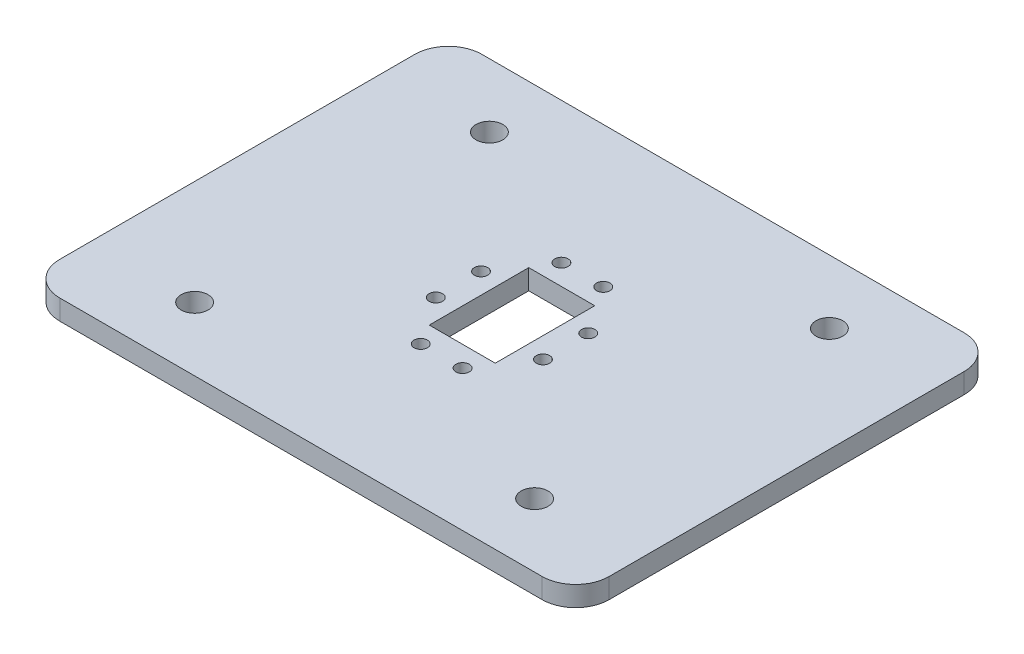
ISO-10303-21;
HEADER;
FILE_DESCRIPTION(('STEP AP214'),'2;1');
FILE_NAME('part.step','',(''),(''),'','','');
FILE_SCHEMA(('AUTOMOTIVE_DESIGN { 1 0 10303 214 1 1 1 1 }'));
ENDSEC;
DATA;
#1=APPLICATION_CONTEXT('core data for automotive mechanical design processes');
#2=APPLICATION_PROTOCOL_DEFINITION('international standard','automotive_design',2000,#1);
#3=PRODUCT_CONTEXT('',#1,'mechanical');
#4=PRODUCT('Part','Part','',(#3));
#5=PRODUCT_RELATED_PRODUCT_CATEGORY('part','',(#4));
#6=PRODUCT_DEFINITION_FORMATION('','',#4);
#7=PRODUCT_DEFINITION_CONTEXT('part definition',#1,'design');
#8=PRODUCT_DEFINITION('design','',#6,#7);
#9=PRODUCT_DEFINITION_SHAPE('','',#8);
#10=(LENGTH_UNIT() NAMED_UNIT(*) SI_UNIT(.MILLI.,.METRE.));
#11=(NAMED_UNIT(*) PLANE_ANGLE_UNIT() SI_UNIT($,.RADIAN.));
#12=(NAMED_UNIT(*) SI_UNIT($,.STERADIAN.) SOLID_ANGLE_UNIT());
#13=UNCERTAINTY_MEASURE_WITH_UNIT(LENGTH_MEASURE(1.E-05),#10,'distance_accuracy_value','');
#14=(GEOMETRIC_REPRESENTATION_CONTEXT(3) GLOBAL_UNCERTAINTY_ASSIGNED_CONTEXT((#13)) GLOBAL_UNIT_ASSIGNED_CONTEXT((#10,
#11,#12)) REPRESENTATION_CONTEXT('',''));
#15=CARTESIAN_POINT('',(0.,0.,0.));
#16=DIRECTION('',(0.,0.,1.));
#17=DIRECTION('',(1.,0.,0.));
#18=AXIS2_PLACEMENT_3D('',#15,#16,#17);
#19=CARTESIAN_POINT('',(0.,6.,0.));
#20=DIRECTION('',(0.,1.,0.));
#21=DIRECTION('',(0.,0.,1.));
#22=AXIS2_PLACEMENT_3D('',#19,#20,#21);
#23=PLANE('',#22);
#24=CARTESIAN_POINT('',(-88.25,6.,-84.));
#25=DIRECTION('',(0.,1.,0.));
#26=DIRECTION('',(0.,0.,1.));
#27=AXIS2_PLACEMENT_3D('',#24,#25,#26);
#28=CIRCLE('',#27,2.);
#29=CARTESIAN_POINT('',(-88.25,6.,-82.));
#30=VERTEX_POINT('',#29);
#31=EDGE_CURVE('E501',#30,#30,#28,.T.);
#32=ORIENTED_EDGE('',*,*,#31,.F.);
#33=EDGE_LOOP('',(#32));
#34=FACE_BOUND('',#33,.T.);
#35=CARTESIAN_POINT('',(-75.75,6.,-84.));
#36=DIRECTION('',(0.,1.,0.));
#37=DIRECTION('',(0.,0.,1.));
#38=AXIS2_PLACEMENT_3D('',#35,#36,#37);
#39=CIRCLE('',#38,2.);
#40=CARTESIAN_POINT('',(-75.75,6.,-82.));
#41=VERTEX_POINT('',#40);
#42=EDGE_CURVE('E511',#41,#41,#39,.T.);
#43=ORIENTED_EDGE('',*,*,#42,.F.);
#44=EDGE_LOOP('',(#43));
#45=FACE_BOUND('',#44,.T.);
#46=CARTESIAN_POINT('',(-98.,6.,-69.75));
#47=DIRECTION('',(0.,1.,0.));
#48=DIRECTION('',(0.,0.,1.));
#49=AXIS2_PLACEMENT_3D('',#46,#47,#48);
#50=CIRCLE('',#49,2.);
#51=CARTESIAN_POINT('',(-98.,6.,-67.75));
#52=VERTEX_POINT('',#51);
#53=EDGE_CURVE('E519',#52,#52,#50,.T.);
#54=ORIENTED_EDGE('',*,*,#53,.F.);
#55=EDGE_LOOP('',(#54));
#56=FACE_BOUND('',#55,.T.);
#57=CARTESIAN_POINT('',(-98.,6.,-56.25));
#58=DIRECTION('',(0.,1.,0.));
#59=DIRECTION('',(0.,0.,1.));
#60=AXIS2_PLACEMENT_3D('',#57,#58,#59);
#61=CIRCLE('',#60,2.);
#62=CARTESIAN_POINT('',(-98.,6.,-54.25));
#63=VERTEX_POINT('',#62);
#64=EDGE_CURVE('E158',#63,#63,#61,.T.);
#65=ORIENTED_EDGE('',*,*,#64,.F.);
#66=EDGE_LOOP('',(#65));
#67=FACE_BOUND('',#66,.T.);
#68=CARTESIAN_POINT('',(-88.25,6.,-42.));
#69=DIRECTION('',(0.,1.,0.));
#70=DIRECTION('',(0.,0.,1.));
#71=AXIS2_PLACEMENT_3D('',#68,#69,#70);
#72=CIRCLE('',#71,2.);
#73=CARTESIAN_POINT('',(-88.25,6.,-40.));
#74=VERTEX_POINT('',#73);
#75=EDGE_CURVE('E460',#74,#74,#72,.T.);
#76=ORIENTED_EDGE('',*,*,#75,.F.);
#77=EDGE_LOOP('',(#76));
#78=FACE_BOUND('',#77,.T.);
#79=CARTESIAN_POINT('',(-75.75,6.,-42.));
#80=DIRECTION('',(0.,1.,0.));
#81=DIRECTION('',(0.,0.,1.));
#82=AXIS2_PLACEMENT_3D('',#79,#80,#81);
#83=CIRCLE('',#82,2.);
#84=CARTESIAN_POINT('',(-75.75,6.,-40.));
#85=VERTEX_POINT('',#84);
#86=EDGE_CURVE('E469',#85,#85,#83,.T.);
#87=ORIENTED_EDGE('',*,*,#86,.F.);
#88=EDGE_LOOP('',(#87));
#89=FACE_BOUND('',#88,.T.);
#90=CARTESIAN_POINT('',(-66.,6.,-56.25));
#91=DIRECTION('',(0.,1.,0.));
#92=DIRECTION('',(0.,0.,1.));
#93=AXIS2_PLACEMENT_3D('',#90,#91,#92);
#94=CIRCLE('',#93,2.);
#95=CARTESIAN_POINT('',(-66.,6.,-54.25));
#96=VERTEX_POINT('',#95);
#97=EDGE_CURVE('E485',#96,#96,#94,.T.);
#98=ORIENTED_EDGE('',*,*,#97,.F.);
#99=EDGE_LOOP('',(#98));
#100=FACE_BOUND('',#99,.T.);
#101=CARTESIAN_POINT('',(-66.,6.,-69.75));
#102=DIRECTION('',(0.,1.,0.));
#103=DIRECTION('',(0.,0.,1.));
#104=AXIS2_PLACEMENT_3D('',#101,#102,#103);
#105=CIRCLE('',#104,2.);
#106=CARTESIAN_POINT('',(-66.,6.,-67.75));
#107=VERTEX_POINT('',#106);
#108=EDGE_CURVE('E493',#107,#107,#105,.T.);
#109=ORIENTED_EDGE('',*,*,#108,.F.);
#110=EDGE_LOOP('',(#109));
#111=FACE_BOUND('',#110,.T.);
#112=DIRECTION('',(0.,0.,1.));
#113=VECTOR('',#112,1.);
#114=CARTESIAN_POINT('',(-91.85,6.,-77.85));
#115=LINE('',#114,#113);
#116=CARTESIAN_POINT('',(-91.85,6.,-77.85));
#117=VERTEX_POINT('',#116);
#118=CARTESIAN_POINT('',(-91.85,6.,-48.15));
#119=VERTEX_POINT('',#118);
#120=EDGE_CURVE('E57',#117,#119,#115,.T.);
#121=ORIENTED_EDGE('',*,*,#120,.F.);
#122=DIRECTION('',(-1.,0.,0.));
#123=VECTOR('',#122,1.);
#124=CARTESIAN_POINT('',(-91.85,6.,-77.85));
#125=LINE('',#124,#123);
#126=CARTESIAN_POINT('',(-72.15,6.,-77.85));
#127=VERTEX_POINT('',#126);
#128=EDGE_CURVE('E151',#127,#117,#125,.T.);
#129=ORIENTED_EDGE('',*,*,#128,.F.);
#130=DIRECTION('',(0.,0.,-1.));
#131=VECTOR('',#130,1.);
#132=CARTESIAN_POINT('',(-72.15,6.,-77.85));
#133=LINE('',#132,#131);
#134=CARTESIAN_POINT('',(-72.15,6.,-48.15));
#135=VERTEX_POINT('',#134);
#136=EDGE_CURVE('E155',#135,#127,#133,.T.);
#137=ORIENTED_EDGE('',*,*,#136,.F.);
#138=DIRECTION('',(1.,0.,0.));
#139=VECTOR('',#138,1.);
#140=CARTESIAN_POINT('',(-91.85,6.,-48.15));
#141=LINE('',#140,#139);
#142=EDGE_CURVE('E169',#119,#135,#141,.T.);
#143=ORIENTED_EDGE('',*,*,#142,.F.);
#144=EDGE_LOOP('',(#121,#129,#137,#143));
#145=FACE_BOUND('',#144,.T.);
#146=CARTESIAN_POINT('',(-132.75,6.,-19.));
#147=DIRECTION('',(0.,1.,0.));
#148=DIRECTION('',(0.,0.,1.));
#149=AXIS2_PLACEMENT_3D('',#146,#147,#148);
#150=CIRCLE('',#149,3.99999999999999);
#151=CARTESIAN_POINT('',(-132.75,6.,-15.));
#152=VERTEX_POINT('',#151);
#153=EDGE_CURVE('E200',#152,#152,#150,.T.);
#154=ORIENTED_EDGE('',*,*,#153,.F.);
#155=EDGE_LOOP('',(#154));
#156=FACE_BOUND('',#155,.T.);
#157=CARTESIAN_POINT('',(-132.75,6.,-107.));
#158=DIRECTION('',(0.,1.,0.));
#159=DIRECTION('',(0.,0.,1.));
#160=AXIS2_PLACEMENT_3D('',#157,#158,#159);
#161=CIRCLE('',#160,3.99999999999999);
#162=CARTESIAN_POINT('',(-132.75,6.,-103.));
#163=VERTEX_POINT('',#162);
#164=EDGE_CURVE('E213',#163,#163,#161,.T.);
#165=ORIENTED_EDGE('',*,*,#164,.F.);
#166=EDGE_LOOP('',(#165));
#167=FACE_BOUND('',#166,.T.);
#168=DIRECTION('',(-1.,0.,0.));
#169=VECTOR('',#168,1.);
#170=CARTESIAN_POINT('',(0.,6.,-126.));
#171=LINE('',#170,#169);
#172=CARTESIAN_POINT('',(-10.,6.,-126.));
#173=VERTEX_POINT('',#172);
#174=CARTESIAN_POINT('',(-154.,6.,-126.));
#175=VERTEX_POINT('',#174);
#176=EDGE_CURVE('E229',#173,#175,#171,.T.);
#177=ORIENTED_EDGE('',*,*,#176,.T.);
#178=CARTESIAN_POINT('',(-154.,6.,-116.));
#179=DIRECTION('',(0.,1.,0.));
#180=DIRECTION('',(0.,0.,1.));
#181=AXIS2_PLACEMENT_3D('',#178,#179,#180);
#182=CIRCLE('',#181,10.);
#183=CARTESIAN_POINT('',(-164.,6.,-116.));
#184=VERTEX_POINT('',#183);
#185=EDGE_CURVE('E243',#175,#184,#182,.T.);
#186=ORIENTED_EDGE('',*,*,#185,.T.);
#187=DIRECTION('',(0.,0.,1.));
#188=VECTOR('',#187,1.);
#189=CARTESIAN_POINT('',(-164.,6.,0.));
#190=LINE('',#189,#188);
#191=CARTESIAN_POINT('',(-164.,6.,-9.99999999999997));
#192=VERTEX_POINT('',#191);
#193=EDGE_CURVE('E254',#184,#192,#190,.T.);
#194=ORIENTED_EDGE('',*,*,#193,.T.);
#195=CARTESIAN_POINT('',(-154.,6.,-9.99999999999997));
#196=DIRECTION('',(0.,1.,0.));
#197=DIRECTION('',(0.,0.,1.));
#198=AXIS2_PLACEMENT_3D('',#195,#196,#197);
#199=CIRCLE('',#198,10.);
#200=CARTESIAN_POINT('',(-154.,6.,0.));
#201=VERTEX_POINT('',#200);
#202=EDGE_CURVE('E303',#192,#201,#199,.T.);
#203=ORIENTED_EDGE('',*,*,#202,.T.);
#204=DIRECTION('',(1.,0.,0.));
#205=VECTOR('',#204,1.);
#206=CARTESIAN_POINT('',(0.,6.,0.));
#207=LINE('',#206,#205);
#208=CARTESIAN_POINT('',(-10.,6.,0.));
#209=VERTEX_POINT('',#208);
#210=EDGE_CURVE('E259',#201,#209,#207,.T.);
#211=ORIENTED_EDGE('',*,*,#210,.T.);
#212=CARTESIAN_POINT('',(-10.,6.,-10.));
#213=DIRECTION('',(0.,1.,0.));
#214=DIRECTION('',(0.,0.,1.));
#215=AXIS2_PLACEMENT_3D('',#212,#213,#214);
#216=CIRCLE('',#215,10.);
#217=CARTESIAN_POINT('',(0.,6.,-10.));
#218=VERTEX_POINT('',#217);
#219=EDGE_CURVE('E244',#209,#218,#216,.T.);
#220=ORIENTED_EDGE('',*,*,#219,.T.);
#221=DIRECTION('',(0.,0.,-1.));
#222=VECTOR('',#221,1.);
#223=CARTESIAN_POINT('',(0.,6.,0.));
#224=LINE('',#223,#222);
#225=CARTESIAN_POINT('',(0.,6.,-116.));
#226=VERTEX_POINT('',#225);
#227=EDGE_CURVE('E225',#218,#226,#224,.T.);
#228=ORIENTED_EDGE('',*,*,#227,.T.);
#229=CARTESIAN_POINT('',(-10.,6.,-116.));
#230=DIRECTION('',(0.,1.,0.));
#231=DIRECTION('',(0.,0.,1.));
#232=AXIS2_PLACEMENT_3D('',#229,#230,#231);
#233=CIRCLE('',#232,10.);
#234=EDGE_CURVE('E239',#226,#173,#233,.T.);
#235=ORIENTED_EDGE('',*,*,#234,.T.);
#236=EDGE_LOOP('',(#177,#186,#194,#203,#211,#220,#228,#235));
#237=FACE_BOUND('',#236,.T.);
#238=CARTESIAN_POINT('',(-31.25,6.,-107.));
#239=DIRECTION('',(0.,1.,0.));
#240=DIRECTION('',(0.,0.,1.));
#241=AXIS2_PLACEMENT_3D('',#238,#239,#240);
#242=CIRCLE('',#241,4.);
#243=CARTESIAN_POINT('',(-31.25,6.,-103.));
#244=VERTEX_POINT('',#243);
#245=EDGE_CURVE('E224',#244,#244,#242,.T.);
#246=ORIENTED_EDGE('',*,*,#245,.F.);
#247=EDGE_LOOP('',(#246));
#248=FACE_BOUND('',#247,.T.);
#249=CARTESIAN_POINT('',(-31.25,6.,-19.));
#250=DIRECTION('',(0.,1.,0.));
#251=DIRECTION('',(0.,0.,1.));
#252=AXIS2_PLACEMENT_3D('',#249,#250,#251);
#253=CIRCLE('',#252,4.);
#254=CARTESIAN_POINT('',(-31.25,6.,-15.));
#255=VERTEX_POINT('',#254);
#256=EDGE_CURVE('E191',#255,#255,#253,.T.);
#257=ORIENTED_EDGE('',*,*,#256,.F.);
#258=EDGE_LOOP('',(#257));
#259=FACE_BOUND('',#258,.T.);
#260=ADVANCED_FACE('F41',(#34,#45,#56,#67,#78,#89,#100,#111,#145,#156,#167,#237,#248,#259),#23,.T.);
#261=CARTESIAN_POINT('',(0.,0.,0.));
#262=DIRECTION('',(0.,1.,0.));
#263=DIRECTION('',(0.,0.,1.));
#264=AXIS2_PLACEMENT_3D('',#261,#262,#263);
#265=PLANE('',#264);
#266=CARTESIAN_POINT('',(-88.25,0.,-84.));
#267=DIRECTION('',(0.,1.,0.));
#268=DIRECTION('',(0.,0.,1.));
#269=AXIS2_PLACEMENT_3D('',#266,#267,#268);
#270=CIRCLE('',#269,2.);
#271=CARTESIAN_POINT('',(-88.25,0.,-82.));
#272=VERTEX_POINT('',#271);
#273=EDGE_CURVE('E170',#272,#272,#270,.T.);
#274=ORIENTED_EDGE('',*,*,#273,.T.);
#275=EDGE_LOOP('',(#274));
#276=FACE_BOUND('',#275,.T.);
#277=CARTESIAN_POINT('',(-75.75,0.,-84.));
#278=DIRECTION('',(0.,1.,0.));
#279=DIRECTION('',(0.,0.,1.));
#280=AXIS2_PLACEMENT_3D('',#277,#278,#279);
#281=CIRCLE('',#280,2.);
#282=CARTESIAN_POINT('',(-75.75,0.,-82.));
#283=VERTEX_POINT('',#282);
#284=EDGE_CURVE('E506',#283,#283,#281,.T.);
#285=ORIENTED_EDGE('',*,*,#284,.T.);
#286=EDGE_LOOP('',(#285));
#287=FACE_BOUND('',#286,.T.);
#288=CARTESIAN_POINT('',(-98.,0.,-69.75));
#289=DIRECTION('',(0.,1.,0.));
#290=DIRECTION('',(0.,0.,1.));
#291=AXIS2_PLACEMENT_3D('',#288,#289,#290);
#292=CIRCLE('',#291,2.);
#293=CARTESIAN_POINT('',(-98.,0.,-67.75));
#294=VERTEX_POINT('',#293);
#295=EDGE_CURVE('E516',#294,#294,#292,.T.);
#296=ORIENTED_EDGE('',*,*,#295,.T.);
#297=EDGE_LOOP('',(#296));
#298=FACE_BOUND('',#297,.T.);
#299=CARTESIAN_POINT('',(-98.,0.,-56.25));
#300=DIRECTION('',(0.,1.,0.));
#301=DIRECTION('',(0.,0.,1.));
#302=AXIS2_PLACEMENT_3D('',#299,#300,#301);
#303=CIRCLE('',#302,2.);
#304=CARTESIAN_POINT('',(-98.,0.,-54.25));
#305=VERTEX_POINT('',#304);
#306=EDGE_CURVE('E523',#305,#305,#303,.T.);
#307=ORIENTED_EDGE('',*,*,#306,.T.);
#308=EDGE_LOOP('',(#307));
#309=FACE_BOUND('',#308,.T.);
#310=CARTESIAN_POINT('',(-88.25,0.,-42.));
#311=DIRECTION('',(0.,1.,0.));
#312=DIRECTION('',(0.,0.,1.));
#313=AXIS2_PLACEMENT_3D('',#310,#311,#312);
#314=CIRCLE('',#313,2.);
#315=CARTESIAN_POINT('',(-88.25,0.,-40.));
#316=VERTEX_POINT('',#315);
#317=EDGE_CURVE('E457',#316,#316,#314,.T.);
#318=ORIENTED_EDGE('',*,*,#317,.T.);
#319=EDGE_LOOP('',(#318));
#320=FACE_BOUND('',#319,.T.);
#321=CARTESIAN_POINT('',(-75.75,0.,-42.));
#322=DIRECTION('',(0.,1.,0.));
#323=DIRECTION('',(0.,0.,1.));
#324=AXIS2_PLACEMENT_3D('',#321,#322,#323);
#325=CIRCLE('',#324,2.);
#326=CARTESIAN_POINT('',(-75.75,0.,-40.));
#327=VERTEX_POINT('',#326);
#328=EDGE_CURVE('E463',#327,#327,#325,.T.);
#329=ORIENTED_EDGE('',*,*,#328,.T.);
#330=EDGE_LOOP('',(#329));
#331=FACE_BOUND('',#330,.T.);
#332=CARTESIAN_POINT('',(-66.,0.,-56.25));
#333=DIRECTION('',(0.,1.,0.));
#334=DIRECTION('',(0.,0.,1.));
#335=AXIS2_PLACEMENT_3D('',#332,#333,#334);
#336=CIRCLE('',#335,2.);
#337=CARTESIAN_POINT('',(-66.,0.,-54.25));
#338=VERTEX_POINT('',#337);
#339=EDGE_CURVE('E482',#338,#338,#336,.T.);
#340=ORIENTED_EDGE('',*,*,#339,.T.);
#341=EDGE_LOOP('',(#340));
#342=FACE_BOUND('',#341,.T.);
#343=CARTESIAN_POINT('',(-66.,0.,-69.75));
#344=DIRECTION('',(0.,1.,0.));
#345=DIRECTION('',(0.,0.,1.));
#346=AXIS2_PLACEMENT_3D('',#343,#344,#345);
#347=CIRCLE('',#346,2.);
#348=CARTESIAN_POINT('',(-66.,0.,-67.75));
#349=VERTEX_POINT('',#348);
#350=EDGE_CURVE('E490',#349,#349,#347,.T.);
#351=ORIENTED_EDGE('',*,*,#350,.T.);
#352=EDGE_LOOP('',(#351));
#353=FACE_BOUND('',#352,.T.);
#354=DIRECTION('',(-1.,0.,0.));
#355=VECTOR('',#354,1.);
#356=CARTESIAN_POINT('',(-91.85,0.,-77.85));
#357=LINE('',#356,#355);
#358=CARTESIAN_POINT('',(-72.15,0.,-77.85));
#359=VERTEX_POINT('',#358);
#360=CARTESIAN_POINT('',(-91.85,0.,-77.85));
#361=VERTEX_POINT('',#360);
#362=EDGE_CURVE('E139',#359,#361,#357,.T.);
#363=ORIENTED_EDGE('',*,*,#362,.T.);
#364=DIRECTION('',(0.,0.,1.));
#365=VECTOR('',#364,1.);
#366=CARTESIAN_POINT('',(-91.85,0.,-77.85));
#367=LINE('',#366,#365);
#368=CARTESIAN_POINT('',(-91.85,0.,-48.15));
#369=VERTEX_POINT('',#368);
#370=EDGE_CURVE('E132',#361,#369,#367,.T.);
#371=ORIENTED_EDGE('',*,*,#370,.T.);
#372=DIRECTION('',(1.,0.,0.));
#373=VECTOR('',#372,1.);
#374=CARTESIAN_POINT('',(-91.85,0.,-48.15));
#375=LINE('',#374,#373);
#376=CARTESIAN_POINT('',(-72.15,0.,-48.15));
#377=VERTEX_POINT('',#376);
#378=EDGE_CURVE('E142',#369,#377,#375,.T.);
#379=ORIENTED_EDGE('',*,*,#378,.T.);
#380=DIRECTION('',(0.,0.,-1.));
#381=VECTOR('',#380,1.);
#382=CARTESIAN_POINT('',(-72.15,0.,-77.85));
#383=LINE('',#382,#381);
#384=EDGE_CURVE('E65',#377,#359,#383,.T.);
#385=ORIENTED_EDGE('',*,*,#384,.T.);
#386=EDGE_LOOP('',(#363,#371,#379,#385));
#387=FACE_BOUND('',#386,.T.);
#388=DIRECTION('',(0.,0.,1.));
#389=VECTOR('',#388,1.);
#390=CARTESIAN_POINT('',(-164.,0.,0.));
#391=LINE('',#390,#389);
#392=CARTESIAN_POINT('',(-164.,0.,-116.));
#393=VERTEX_POINT('',#392);
#394=CARTESIAN_POINT('',(-164.,0.,-9.99999999999997));
#395=VERTEX_POINT('',#394);
#396=EDGE_CURVE('E272',#393,#395,#391,.T.);
#397=ORIENTED_EDGE('',*,*,#396,.F.);
#398=CARTESIAN_POINT('',(-154.,0.,-116.));
#399=DIRECTION('',(0.,1.,0.));
#400=DIRECTION('',(0.,0.,1.));
#401=AXIS2_PLACEMENT_3D('',#398,#399,#400);
#402=CIRCLE('',#401,10.);
#403=CARTESIAN_POINT('',(-154.,0.,-126.));
#404=VERTEX_POINT('',#403);
#405=EDGE_CURVE('E294',#393,#404,#402,.F.);
#406=ORIENTED_EDGE('',*,*,#405,.T.);
#407=DIRECTION('',(-1.,0.,0.));
#408=VECTOR('',#407,1.);
#409=CARTESIAN_POINT('',(0.,0.,-126.));
#410=LINE('',#409,#408);
#411=CARTESIAN_POINT('',(-10.,0.,-126.));
#412=VERTEX_POINT('',#411);
#413=EDGE_CURVE('E268',#412,#404,#410,.T.);
#414=ORIENTED_EDGE('',*,*,#413,.F.);
#415=CARTESIAN_POINT('',(-10.,0.,-116.));
#416=DIRECTION('',(0.,1.,0.));
#417=DIRECTION('',(0.,0.,1.));
#418=AXIS2_PLACEMENT_3D('',#415,#416,#417);
#419=CIRCLE('',#418,10.);
#420=CARTESIAN_POINT('',(0.,0.,-116.));
#421=VERTEX_POINT('',#420);
#422=EDGE_CURVE('E291',#412,#421,#419,.F.);
#423=ORIENTED_EDGE('',*,*,#422,.T.);
#424=DIRECTION('',(0.,0.,-1.));
#425=VECTOR('',#424,1.);
#426=CARTESIAN_POINT('',(0.,0.,0.));
#427=LINE('',#426,#425);
#428=CARTESIAN_POINT('',(0.,0.,-10.));
#429=VERTEX_POINT('',#428);
#430=EDGE_CURVE('E219',#429,#421,#427,.T.);
#431=ORIENTED_EDGE('',*,*,#430,.F.);
#432=CARTESIAN_POINT('',(-10.,0.,-10.));
#433=DIRECTION('',(0.,1.,0.));
#434=DIRECTION('',(0.,0.,1.));
#435=AXIS2_PLACEMENT_3D('',#432,#433,#434);
#436=CIRCLE('',#435,10.);
#437=CARTESIAN_POINT('',(-10.,0.,0.));
#438=VERTEX_POINT('',#437);
#439=EDGE_CURVE('E288',#429,#438,#436,.F.);
#440=ORIENTED_EDGE('',*,*,#439,.T.);
#441=DIRECTION('',(1.,0.,0.));
#442=VECTOR('',#441,1.);
#443=CARTESIAN_POINT('',(0.,0.,0.));
#444=LINE('',#443,#442);
#445=CARTESIAN_POINT('',(-154.,0.,0.));
#446=VERTEX_POINT('',#445);
#447=EDGE_CURVE('E230',#446,#438,#444,.T.);
#448=ORIENTED_EDGE('',*,*,#447,.F.);
#449=CARTESIAN_POINT('',(-154.,0.,-9.99999999999997));
#450=DIRECTION('',(0.,1.,0.));
#451=DIRECTION('',(0.,0.,1.));
#452=AXIS2_PLACEMENT_3D('',#449,#450,#451);
#453=CIRCLE('',#452,10.);
#454=EDGE_CURVE('E285',#446,#395,#453,.F.);
#455=ORIENTED_EDGE('',*,*,#454,.T.);
#456=EDGE_LOOP('',(#397,#406,#414,#423,#431,#440,#448,#455));
#457=FACE_BOUND('',#456,.T.);
#458=CARTESIAN_POINT('',(-132.75,0.,-107.));
#459=DIRECTION('',(0.,1.,0.));
#460=DIRECTION('',(0.,0.,1.));
#461=AXIS2_PLACEMENT_3D('',#458,#459,#460);
#462=CIRCLE('',#461,3.99999999999999);
#463=CARTESIAN_POINT('',(-132.75,0.,-103.));
#464=VERTEX_POINT('',#463);
#465=EDGE_CURVE('E220',#464,#464,#462,.T.);
#466=ORIENTED_EDGE('',*,*,#465,.T.);
#467=EDGE_LOOP('',(#466));
#468=FACE_BOUND('',#467,.T.);
#469=CARTESIAN_POINT('',(-31.25,0.,-107.));
#470=DIRECTION('',(0.,1.,0.));
#471=DIRECTION('',(0.,0.,1.));
#472=AXIS2_PLACEMENT_3D('',#469,#470,#471);
#473=CIRCLE('',#472,4.);
#474=CARTESIAN_POINT('',(-31.25,0.,-103.));
#475=VERTEX_POINT('',#474);
#476=EDGE_CURVE('E205',#475,#475,#473,.T.);
#477=ORIENTED_EDGE('',*,*,#476,.T.);
#478=EDGE_LOOP('',(#477));
#479=FACE_BOUND('',#478,.T.);
#480=CARTESIAN_POINT('',(-132.75,0.,-19.));
#481=DIRECTION('',(0.,1.,0.));
#482=DIRECTION('',(0.,0.,1.));
#483=AXIS2_PLACEMENT_3D('',#480,#481,#482);
#484=CIRCLE('',#483,3.99999999999999);
#485=CARTESIAN_POINT('',(-132.75,0.,-15.));
#486=VERTEX_POINT('',#485);
#487=EDGE_CURVE('E196',#486,#486,#484,.T.);
#488=ORIENTED_EDGE('',*,*,#487,.T.);
#489=EDGE_LOOP('',(#488));
#490=FACE_BOUND('',#489,.T.);
#491=CARTESIAN_POINT('',(-31.25,0.,-19.));
#492=DIRECTION('',(0.,1.,0.));
#493=DIRECTION('',(0.,0.,1.));
#494=AXIS2_PLACEMENT_3D('',#491,#492,#493);
#495=CIRCLE('',#494,4.);
#496=CARTESIAN_POINT('',(-31.25,0.,-15.));
#497=VERTEX_POINT('',#496);
#498=EDGE_CURVE('E186',#497,#497,#495,.T.);
#499=ORIENTED_EDGE('',*,*,#498,.T.);
#500=EDGE_LOOP('',(#499));
#501=FACE_BOUND('',#500,.T.);
#502=ADVANCED_FACE('F147',(#276,#287,#298,#309,#320,#331,#342,#353,#387,#457,#468,#479,#490,
#501),#265,.F.);
#503=CARTESIAN_POINT('',(0.,6.,0.));
#504=DIRECTION('',(-1.,0.,0.));
#505=DIRECTION('',(0.,0.,1.));
#506=AXIS2_PLACEMENT_3D('',#503,#504,#505);
#507=PLANE('',#506);
#508=ORIENTED_EDGE('',*,*,#430,.T.);
#509=DIRECTION('',(0.,-1.,0.));
#510=VECTOR('',#509,1.);
#511=CARTESIAN_POINT('',(0.,6.,-116.));
#512=LINE('',#511,#510);
#513=EDGE_CURVE('E323',#421,#226,#512,.F.);
#514=ORIENTED_EDGE('',*,*,#513,.T.);
#515=ORIENTED_EDGE('',*,*,#227,.F.);
#516=DIRECTION('',(0.,-1.,0.));
#517=VECTOR('',#516,1.);
#518=CARTESIAN_POINT('',(0.,6.,-10.));
#519=LINE('',#518,#517);
#520=EDGE_CURVE('E250',#218,#429,#519,.T.);
#521=ORIENTED_EDGE('',*,*,#520,.T.);
#522=EDGE_LOOP('',(#508,#514,#515,#521));
#523=FACE_BOUND('',#522,.T.);
#524=ADVANCED_FACE('F320',(#523),#507,.F.);
#525=CARTESIAN_POINT('',(0.,6.,-126.));
#526=DIRECTION('',(0.,0.,1.));
#527=DIRECTION('',(1.,0.,0.));
#528=AXIS2_PLACEMENT_3D('',#525,#526,#527);
#529=PLANE('',#528);
#530=ORIENTED_EDGE('',*,*,#413,.T.);
#531=DIRECTION('',(0.,-1.,0.));
#532=VECTOR('',#531,1.);
#533=CARTESIAN_POINT('',(-154.,6.,-126.));
#534=LINE('',#533,#532);
#535=EDGE_CURVE('E301',#404,#175,#534,.F.);
#536=ORIENTED_EDGE('',*,*,#535,.T.);
#537=ORIENTED_EDGE('',*,*,#176,.F.);
#538=DIRECTION('',(0.,-1.,0.));
#539=VECTOR('',#538,1.);
#540=CARTESIAN_POINT('',(-10.,6.,-126.));
#541=LINE('',#540,#539);
#542=EDGE_CURVE('E297',#173,#412,#541,.T.);
#543=ORIENTED_EDGE('',*,*,#542,.T.);
#544=EDGE_LOOP('',(#530,#536,#537,#543));
#545=FACE_BOUND('',#544,.T.);
#546=ADVANCED_FACE('F343',(#545),#529,.F.);
#547=CARTESIAN_POINT('',(-164.,6.,0.));
#548=DIRECTION('',(1.,0.,0.));
#549=DIRECTION('',(0.,0.,-1.));
#550=AXIS2_PLACEMENT_3D('',#547,#548,#549);
#551=PLANE('',#550);
#552=ORIENTED_EDGE('',*,*,#193,.F.);
#553=DIRECTION('',(0.,-1.,0.));
#554=VECTOR('',#553,1.);
#555=CARTESIAN_POINT('',(-164.,6.,-116.));
#556=LINE('',#555,#554);
#557=EDGE_CURVE('E281',#184,#393,#556,.T.);
#558=ORIENTED_EDGE('',*,*,#557,.T.);
#559=ORIENTED_EDGE('',*,*,#396,.T.);
#560=DIRECTION('',(0.,-1.,0.));
#561=VECTOR('',#560,1.);
#562=CARTESIAN_POINT('',(-164.,6.,-9.99999999999997));
#563=LINE('',#562,#561);
#564=EDGE_CURVE('E264',#395,#192,#563,.F.);
#565=ORIENTED_EDGE('',*,*,#564,.T.);
#566=EDGE_LOOP('',(#552,#558,#559,#565));
#567=FACE_BOUND('',#566,.T.);
#568=ADVANCED_FACE('F386',(#567),#551,.F.);
#569=CARTESIAN_POINT('',(0.,6.,0.));
#570=DIRECTION('',(0.,0.,-1.));
#571=DIRECTION('',(-1.,0.,0.));
#572=AXIS2_PLACEMENT_3D('',#569,#570,#571);
#573=PLANE('',#572);
#574=ORIENTED_EDGE('',*,*,#447,.T.);
#575=DIRECTION('',(0.,-1.,0.));
#576=VECTOR('',#575,1.);
#577=CARTESIAN_POINT('',(-10.,6.,0.));
#578=LINE('',#577,#576);
#579=EDGE_CURVE('E12',#438,#209,#578,.F.);
#580=ORIENTED_EDGE('',*,*,#579,.T.);
#581=ORIENTED_EDGE('',*,*,#210,.F.);
#582=DIRECTION('',(0.,-1.,0.));
#583=VECTOR('',#582,1.);
#584=CARTESIAN_POINT('',(-154.,6.,0.));
#585=LINE('',#584,#583);
#586=EDGE_CURVE('E50',#201,#446,#585,.T.);
#587=ORIENTED_EDGE('',*,*,#586,.T.);
#588=EDGE_LOOP('',(#574,#580,#581,#587));
#589=FACE_BOUND('',#588,.T.);
#590=ADVANCED_FACE('F332',(#589),#573,.F.);
#591=CARTESIAN_POINT('',(-132.75,6.,-107.));
#592=DIRECTION('',(0.,-1.,0.));
#593=DIRECTION('',(0.,0.,-1.));
#594=AXIS2_PLACEMENT_3D('',#591,#592,#593);
#595=CYLINDRICAL_SURFACE('',#594,3.99999999999999);
#596=ORIENTED_EDGE('',*,*,#164,.T.);
#597=EDGE_LOOP('',(#596));
#598=FACE_BOUND('',#597,.T.);
#599=ORIENTED_EDGE('',*,*,#465,.F.);
#600=EDGE_LOOP('',(#599));
#601=FACE_BOUND('',#600,.T.);
#602=ADVANCED_FACE('F369',(#598,#601),#595,.F.);
#603=CARTESIAN_POINT('',(-31.25,6.,-107.));
#604=DIRECTION('',(0.,-1.,0.));
#605=DIRECTION('',(0.,0.,-1.));
#606=AXIS2_PLACEMENT_3D('',#603,#604,#605);
#607=CYLINDRICAL_SURFACE('',#606,4.);
#608=ORIENTED_EDGE('',*,*,#245,.T.);
#609=EDGE_LOOP('',(#608));
#610=FACE_BOUND('',#609,.T.);
#611=ORIENTED_EDGE('',*,*,#476,.F.);
#612=EDGE_LOOP('',(#611));
#613=FACE_BOUND('',#612,.T.);
#614=ADVANCED_FACE('F359',(#610,#613),#607,.F.);
#615=CARTESIAN_POINT('',(-132.75,6.,-19.));
#616=DIRECTION('',(0.,-1.,0.));
#617=DIRECTION('',(0.,0.,-1.));
#618=AXIS2_PLACEMENT_3D('',#615,#616,#617);
#619=CYLINDRICAL_SURFACE('',#618,3.99999999999999);
#620=ORIENTED_EDGE('',*,*,#153,.T.);
#621=EDGE_LOOP('',(#620));
#622=FACE_BOUND('',#621,.T.);
#623=ORIENTED_EDGE('',*,*,#487,.F.);
#624=EDGE_LOOP('',(#623));
#625=FACE_BOUND('',#624,.T.);
#626=ADVANCED_FACE('F356',(#622,#625),#619,.F.);
#627=CARTESIAN_POINT('',(-31.25,6.,-19.));
#628=DIRECTION('',(0.,-1.,0.));
#629=DIRECTION('',(0.,0.,-1.));
#630=AXIS2_PLACEMENT_3D('',#627,#628,#629);
#631=CYLINDRICAL_SURFACE('',#630,4.);
#632=ORIENTED_EDGE('',*,*,#256,.T.);
#633=EDGE_LOOP('',(#632));
#634=FACE_BOUND('',#633,.T.);
#635=ORIENTED_EDGE('',*,*,#498,.F.);
#636=EDGE_LOOP('',(#635));
#637=FACE_BOUND('',#636,.T.);
#638=ADVANCED_FACE('F358',(#634,#637),#631,.F.);
#639=CARTESIAN_POINT('',(-154.,6.,-116.));
#640=DIRECTION('',(0.,-1.,0.));
#641=DIRECTION('',(0.,0.,-1.));
#642=AXIS2_PLACEMENT_3D('',#639,#640,#641);
#643=CYLINDRICAL_SURFACE('',#642,10.);
#644=ORIENTED_EDGE('',*,*,#185,.F.);
#645=ORIENTED_EDGE('',*,*,#535,.F.);
#646=ORIENTED_EDGE('',*,*,#405,.F.);
#647=ORIENTED_EDGE('',*,*,#557,.F.);
#648=EDGE_LOOP('',(#644,#645,#646,#647));
#649=FACE_BOUND('',#648,.T.);
#650=ADVANCED_FACE('F366',(#649),#643,.T.);
#651=CARTESIAN_POINT('',(-10.,6.,-116.));
#652=DIRECTION('',(0.,-1.,0.));
#653=DIRECTION('',(0.,0.,-1.));
#654=AXIS2_PLACEMENT_3D('',#651,#652,#653);
#655=CYLINDRICAL_SURFACE('',#654,10.);
#656=ORIENTED_EDGE('',*,*,#234,.F.);
#657=ORIENTED_EDGE('',*,*,#513,.F.);
#658=ORIENTED_EDGE('',*,*,#422,.F.);
#659=ORIENTED_EDGE('',*,*,#542,.F.);
#660=EDGE_LOOP('',(#656,#657,#658,#659));
#661=FACE_BOUND('',#660,.T.);
#662=ADVANCED_FACE('F338',(#661),#655,.T.);
#663=CARTESIAN_POINT('',(-10.,6.,-10.));
#664=DIRECTION('',(0.,-1.,0.));
#665=DIRECTION('',(0.,0.,-1.));
#666=AXIS2_PLACEMENT_3D('',#663,#664,#665);
#667=CYLINDRICAL_SURFACE('',#666,10.);
#668=ORIENTED_EDGE('',*,*,#219,.F.);
#669=ORIENTED_EDGE('',*,*,#579,.F.);
#670=ORIENTED_EDGE('',*,*,#439,.F.);
#671=ORIENTED_EDGE('',*,*,#520,.F.);
#672=EDGE_LOOP('',(#668,#669,#670,#671));
#673=FACE_BOUND('',#672,.T.);
#674=ADVANCED_FACE('F324',(#673),#667,.T.);
#675=CARTESIAN_POINT('',(-154.,6.,-9.99999999999997));
#676=DIRECTION('',(0.,-1.,0.));
#677=DIRECTION('',(0.,0.,-1.));
#678=AXIS2_PLACEMENT_3D('',#675,#676,#677);
#679=CYLINDRICAL_SURFACE('',#678,10.);
#680=ORIENTED_EDGE('',*,*,#202,.F.);
#681=ORIENTED_EDGE('',*,*,#564,.F.);
#682=ORIENTED_EDGE('',*,*,#454,.F.);
#683=ORIENTED_EDGE('',*,*,#586,.F.);
#684=EDGE_LOOP('',(#680,#681,#682,#683));
#685=FACE_BOUND('',#684,.T.);
#686=ADVANCED_FACE('F43',(#685),#679,.T.);
#687=CARTESIAN_POINT('',(-91.85,0.,-77.85));
#688=DIRECTION('',(-1.,0.,0.));
#689=DIRECTION('',(0.,0.,1.));
#690=AXIS2_PLACEMENT_3D('',#687,#688,#689);
#691=PLANE('',#690);
#692=ORIENTED_EDGE('',*,*,#120,.T.);
#693=DIRECTION('',(0.,1.,0.));
#694=VECTOR('',#693,1.);
#695=CARTESIAN_POINT('',(-91.85,0.,-48.15));
#696=LINE('',#695,#694);
#697=EDGE_CURVE('E128',#369,#119,#696,.T.);
#698=ORIENTED_EDGE('',*,*,#697,.F.);
#699=ORIENTED_EDGE('',*,*,#370,.F.);
#700=DIRECTION('',(0.,1.,0.));
#701=VECTOR('',#700,1.);
#702=CARTESIAN_POINT('',(-91.85,0.,-77.85));
#703=LINE('',#702,#701);
#704=EDGE_CURVE('E183',#361,#117,#703,.T.);
#705=ORIENTED_EDGE('',*,*,#704,.T.);
#706=EDGE_LOOP('',(#692,#698,#699,#705));
#707=FACE_BOUND('',#706,.T.);
#708=ADVANCED_FACE('F130',(#707),#691,.F.);
#709=CARTESIAN_POINT('',(-91.85,0.,-77.85));
#710=DIRECTION('',(0.,0.,-1.));
#711=DIRECTION('',(-1.,0.,0.));
#712=AXIS2_PLACEMENT_3D('',#709,#710,#711);
#713=PLANE('',#712);
#714=ORIENTED_EDGE('',*,*,#128,.T.);
#715=ORIENTED_EDGE('',*,*,#704,.F.);
#716=ORIENTED_EDGE('',*,*,#362,.F.);
#717=DIRECTION('',(0.,1.,0.));
#718=VECTOR('',#717,1.);
#719=CARTESIAN_POINT('',(-72.15,0.,-77.85));
#720=LINE('',#719,#718);
#721=EDGE_CURVE('E187',#359,#127,#720,.T.);
#722=ORIENTED_EDGE('',*,*,#721,.T.);
#723=EDGE_LOOP('',(#714,#715,#716,#722));
#724=FACE_BOUND('',#723,.T.);
#725=ADVANCED_FACE('F405',(#724),#713,.F.);
#726=CARTESIAN_POINT('',(-72.15,0.,-77.85));
#727=DIRECTION('',(1.,0.,0.));
#728=DIRECTION('',(0.,0.,-1.));
#729=AXIS2_PLACEMENT_3D('',#726,#727,#728);
#730=PLANE('',#729);
#731=ORIENTED_EDGE('',*,*,#136,.T.);
#732=ORIENTED_EDGE('',*,*,#721,.F.);
#733=ORIENTED_EDGE('',*,*,#384,.F.);
#734=DIRECTION('',(0.,1.,0.));
#735=VECTOR('',#734,1.);
#736=CARTESIAN_POINT('',(-72.15,0.,-48.15));
#737=LINE('',#736,#735);
#738=EDGE_CURVE('E138',#377,#135,#737,.T.);
#739=ORIENTED_EDGE('',*,*,#738,.T.);
#740=EDGE_LOOP('',(#731,#732,#733,#739));
#741=FACE_BOUND('',#740,.T.);
#742=ADVANCED_FACE('F413',(#741),#730,.F.);
#743=CARTESIAN_POINT('',(-91.85,0.,-48.15));
#744=DIRECTION('',(0.,0.,1.));
#745=DIRECTION('',(1.,0.,0.));
#746=AXIS2_PLACEMENT_3D('',#743,#744,#745);
#747=PLANE('',#746);
#748=ORIENTED_EDGE('',*,*,#142,.T.);
#749=ORIENTED_EDGE('',*,*,#738,.F.);
#750=ORIENTED_EDGE('',*,*,#378,.F.);
#751=ORIENTED_EDGE('',*,*,#697,.T.);
#752=EDGE_LOOP('',(#748,#749,#750,#751));
#753=FACE_BOUND('',#752,.T.);
#754=ADVANCED_FACE('F143',(#753),#747,.F.);
#755=CARTESIAN_POINT('',(-66.,0.,-69.75));
#756=DIRECTION('',(0.,1.,0.));
#757=DIRECTION('',(0.,0.,1.));
#758=AXIS2_PLACEMENT_3D('',#755,#756,#757);
#759=CYLINDRICAL_SURFACE('',#758,2.);
#760=ORIENTED_EDGE('',*,*,#350,.F.);
#761=EDGE_LOOP('',(#760));
#762=FACE_BOUND('',#761,.T.);
#763=ORIENTED_EDGE('',*,*,#108,.T.);
#764=EDGE_LOOP('',(#763));
#765=FACE_BOUND('',#764,.T.);
#766=ADVANCED_FACE('F419',(#762,#765),#759,.F.);
#767=CARTESIAN_POINT('',(-66.,0.,-56.25));
#768=DIRECTION('',(0.,1.,0.));
#769=DIRECTION('',(0.,0.,1.));
#770=AXIS2_PLACEMENT_3D('',#767,#768,#769);
#771=CYLINDRICAL_SURFACE('',#770,2.);
#772=ORIENTED_EDGE('',*,*,#339,.F.);
#773=EDGE_LOOP('',(#772));
#774=FACE_BOUND('',#773,.T.);
#775=ORIENTED_EDGE('',*,*,#97,.T.);
#776=EDGE_LOOP('',(#775));
#777=FACE_BOUND('',#776,.T.);
#778=ADVANCED_FACE('F441',(#774,#777),#771,.F.);
#779=CARTESIAN_POINT('',(-75.75,0.,-42.));
#780=DIRECTION('',(0.,1.,0.));
#781=DIRECTION('',(0.,0.,1.));
#782=AXIS2_PLACEMENT_3D('',#779,#780,#781);
#783=CYLINDRICAL_SURFACE('',#782,2.);
#784=ORIENTED_EDGE('',*,*,#328,.F.);
#785=EDGE_LOOP('',(#784));
#786=FACE_BOUND('',#785,.T.);
#787=ORIENTED_EDGE('',*,*,#86,.T.);
#788=EDGE_LOOP('',(#787));
#789=FACE_BOUND('',#788,.T.);
#790=ADVANCED_FACE('F445',(#786,#789),#783,.F.);
#791=CARTESIAN_POINT('',(-88.25,0.,-42.));
#792=DIRECTION('',(0.,1.,0.));
#793=DIRECTION('',(0.,0.,1.));
#794=AXIS2_PLACEMENT_3D('',#791,#792,#793);
#795=CYLINDRICAL_SURFACE('',#794,2.);
#796=ORIENTED_EDGE('',*,*,#317,.F.);
#797=EDGE_LOOP('',(#796));
#798=FACE_BOUND('',#797,.T.);
#799=ORIENTED_EDGE('',*,*,#75,.T.);
#800=EDGE_LOOP('',(#799));
#801=FACE_BOUND('',#800,.T.);
#802=ADVANCED_FACE('F426',(#798,#801),#795,.F.);
#803=CARTESIAN_POINT('',(-98.,0.,-56.25));
#804=DIRECTION('',(0.,1.,0.));
#805=DIRECTION('',(0.,0.,1.));
#806=AXIS2_PLACEMENT_3D('',#803,#804,#805);
#807=CYLINDRICAL_SURFACE('',#806,2.);
#808=ORIENTED_EDGE('',*,*,#306,.F.);
#809=EDGE_LOOP('',(#808));
#810=FACE_BOUND('',#809,.T.);
#811=ORIENTED_EDGE('',*,*,#64,.T.);
#812=EDGE_LOOP('',(#811));
#813=FACE_BOUND('',#812,.T.);
#814=ADVANCED_FACE('F422',(#810,#813),#807,.F.);
#815=CARTESIAN_POINT('',(-98.,0.,-69.75));
#816=DIRECTION('',(0.,1.,0.));
#817=DIRECTION('',(0.,0.,1.));
#818=AXIS2_PLACEMENT_3D('',#815,#816,#817);
#819=CYLINDRICAL_SURFACE('',#818,2.);
#820=ORIENTED_EDGE('',*,*,#295,.F.);
#821=EDGE_LOOP('',(#820));
#822=FACE_BOUND('',#821,.T.);
#823=ORIENTED_EDGE('',*,*,#53,.T.);
#824=EDGE_LOOP('',(#823));
#825=FACE_BOUND('',#824,.T.);
#826=ADVANCED_FACE('F425',(#822,#825),#819,.F.);
#827=CARTESIAN_POINT('',(-75.75,0.,-84.));
#828=DIRECTION('',(0.,1.,0.));
#829=DIRECTION('',(0.,0.,1.));
#830=AXIS2_PLACEMENT_3D('',#827,#828,#829);
#831=CYLINDRICAL_SURFACE('',#830,2.);
#832=ORIENTED_EDGE('',*,*,#284,.F.);
#833=EDGE_LOOP('',(#832));
#834=FACE_BOUND('',#833,.T.);
#835=ORIENTED_EDGE('',*,*,#42,.T.);
#836=EDGE_LOOP('',(#835));
#837=FACE_BOUND('',#836,.T.);
#838=ADVANCED_FACE('F430',(#834,#837),#831,.F.);
#839=CARTESIAN_POINT('',(-88.25,0.,-84.));
#840=DIRECTION('',(0.,1.,0.));
#841=DIRECTION('',(0.,0.,1.));
#842=AXIS2_PLACEMENT_3D('',#839,#840,#841);
#843=CYLINDRICAL_SURFACE('',#842,2.);
#844=ORIENTED_EDGE('',*,*,#273,.F.);
#845=EDGE_LOOP('',(#844));
#846=FACE_BOUND('',#845,.T.);
#847=ORIENTED_EDGE('',*,*,#31,.T.);
#848=EDGE_LOOP('',(#847));
#849=FACE_BOUND('',#848,.T.);
#850=ADVANCED_FACE('F434',(#846,#849),#843,.F.);
#851=CLOSED_SHELL('',(#260,#502,#524,#546,#568,#590,#602,#614,#626,#638,#650,#662,#674,#686,
#708,#725,#742,#754,#766,#778,#790,#802,#814,#826,#838,#850));
#852=MANIFOLD_SOLID_BREP('B2',#851);
#853=ADVANCED_BREP_SHAPE_REPRESENTATION('',(#18,#852),#14);
#854=SHAPE_DEFINITION_REPRESENTATION(#9,#853);
ENDSEC;
END-ISO-10303-21;
